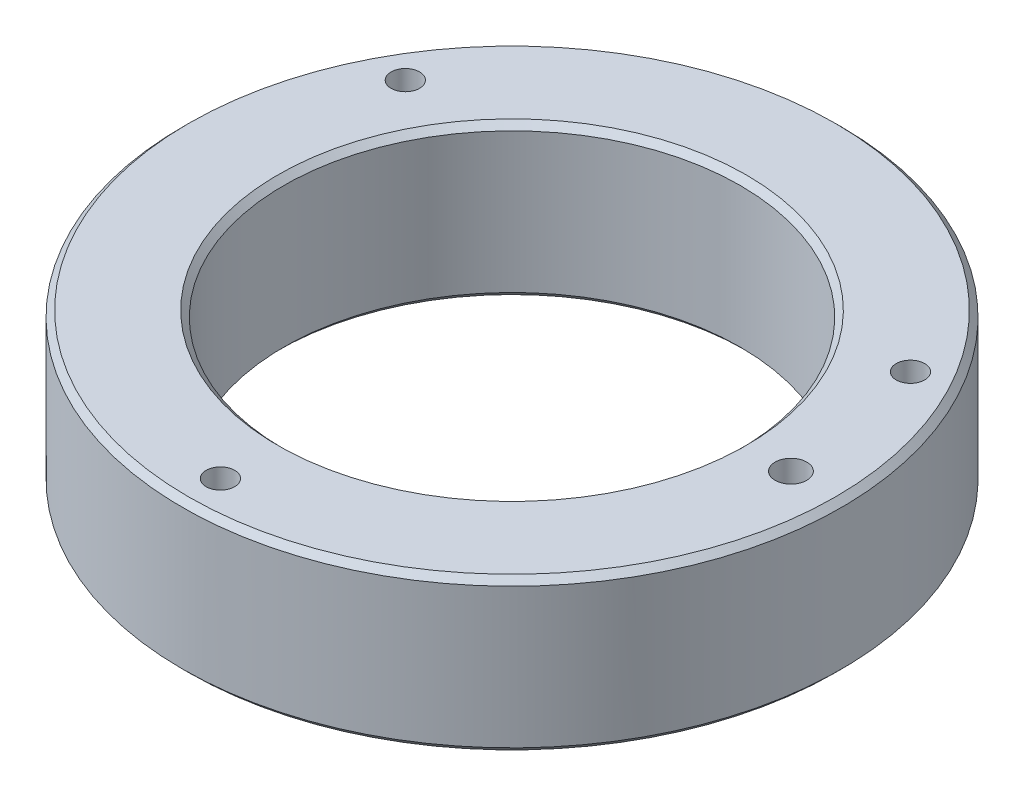
ISO-10303-21;
HEADER;
FILE_DESCRIPTION(('STEP AP214'),'2;1');
FILE_NAME('part.step','',(''),(''),'','','');
FILE_SCHEMA(('AUTOMOTIVE_DESIGN { 1 0 10303 214 1 1 1 1 }'));
ENDSEC;
DATA;
#1=APPLICATION_CONTEXT('core data for automotive mechanical design processes');
#2=APPLICATION_PROTOCOL_DEFINITION('international standard','automotive_design',2000,#1);
#3=PRODUCT_CONTEXT('',#1,'mechanical');
#4=PRODUCT('Part','Part','',(#3));
#5=PRODUCT_RELATED_PRODUCT_CATEGORY('part','',(#4));
#6=PRODUCT_DEFINITION_FORMATION('','',#4);
#7=PRODUCT_DEFINITION_CONTEXT('part definition',#1,'design');
#8=PRODUCT_DEFINITION('design','',#6,#7);
#9=PRODUCT_DEFINITION_SHAPE('','',#8);
#10=(LENGTH_UNIT() NAMED_UNIT(*) SI_UNIT(.MILLI.,.METRE.));
#11=(NAMED_UNIT(*) PLANE_ANGLE_UNIT() SI_UNIT($,.RADIAN.));
#12=(NAMED_UNIT(*) SI_UNIT($,.STERADIAN.) SOLID_ANGLE_UNIT());
#13=UNCERTAINTY_MEASURE_WITH_UNIT(LENGTH_MEASURE(1.E-05),#10,'distance_accuracy_value','');
#14=(GEOMETRIC_REPRESENTATION_CONTEXT(3) GLOBAL_UNCERTAINTY_ASSIGNED_CONTEXT((#13)) GLOBAL_UNIT_ASSIGNED_CONTEXT((#10,
#11,#12)) REPRESENTATION_CONTEXT('',''));
#15=CARTESIAN_POINT('',(0.,0.,0.));
#16=DIRECTION('',(0.,0.,1.));
#17=DIRECTION('',(1.,0.,0.));
#18=AXIS2_PLACEMENT_3D('',#15,#16,#17);
#19=CARTESIAN_POINT('',(-57.15,-19.05,0.));
#20=DIRECTION('',(0.,1.,0.));
#21=DIRECTION('',(0.,0.,1.));
#22=AXIS2_PLACEMENT_3D('',#19,#20,#21);
#23=PLANE('',#22);
#24=CARTESIAN_POINT('',(69.85,-19.05,0.));
#25=DIRECTION('',(0.,-1.,0.));
#26=DIRECTION('',(0.,0.,-1.));
#27=AXIS2_PLACEMENT_3D('',#24,#25,#26);
#28=CIRCLE('',#27,3.96874999999999);
#29=CARTESIAN_POINT('',(69.85,-19.05,-3.96874999999999));
#30=VERTEX_POINT('',#29);
#31=EDGE_CURVE('E117',#30,#30,#28,.T.);
#32=ORIENTED_EDGE('',*,*,#31,.F.);
#33=EDGE_LOOP('',(#32));
#34=FACE_BOUND('',#33,.T.);
#35=CARTESIAN_POINT('',(0.,-19.05,73.025));
#36=DIRECTION('',(0.,-1.,0.));
#37=DIRECTION('',(0.,0.,-1.));
#38=AXIS2_PLACEMENT_3D('',#35,#36,#37);
#39=CIRCLE('',#38,5.56259999999999);
#40=CARTESIAN_POINT('',(0.,-19.05,67.4624));
#41=VERTEX_POINT('',#40);
#42=EDGE_CURVE('E111',#41,#41,#39,.T.);
#43=ORIENTED_EDGE('',*,*,#42,.F.);
#44=EDGE_LOOP('',(#43));
#45=FACE_BOUND('',#44,.T.);
#46=CARTESIAN_POINT('',(63.246,-19.05,-36.5252));
#47=DIRECTION('',(0.,-1.,0.));
#48=DIRECTION('',(0.,0.,-1.));
#49=AXIS2_PLACEMENT_3D('',#46,#47,#48);
#50=CIRCLE('',#49,5.5626);
#51=CARTESIAN_POINT('',(63.246,-19.05,-42.0878));
#52=VERTEX_POINT('',#51);
#53=EDGE_CURVE('E99',#52,#52,#50,.T.);
#54=ORIENTED_EDGE('',*,*,#53,.F.);
#55=EDGE_LOOP('',(#54));
#56=FACE_BOUND('',#55,.T.);
#57=CARTESIAN_POINT('',(-63.246,-19.05,-36.5252));
#58=DIRECTION('',(0.,-1.,0.));
#59=DIRECTION('',(0.,0.,-1.));
#60=AXIS2_PLACEMENT_3D('',#57,#58,#59);
#61=CIRCLE('',#60,5.56259999999999);
#62=CARTESIAN_POINT('',(-63.246,-19.05,-42.0878));
#63=VERTEX_POINT('',#62);
#64=EDGE_CURVE('E87',#63,#63,#61,.T.);
#65=ORIENTED_EDGE('',*,*,#64,.F.);
#66=EDGE_LOOP('',(#65));
#67=FACE_BOUND('',#66,.T.);
#68=CARTESIAN_POINT('',(0.,-19.05,0.));
#69=DIRECTION('',(0.,1.,0.));
#70=DIRECTION('',(0.,0.,1.));
#71=AXIS2_PLACEMENT_3D('',#68,#69,#70);
#72=CIRCLE('',#71,58.674);
#73=CARTESIAN_POINT('',(0.,-19.05,-58.674));
#74=VERTEX_POINT('',#73);
#75=EDGE_CURVE('E57',#74,#74,#72,.T.);
#76=ORIENTED_EDGE('',*,*,#75,.T.);
#77=EDGE_LOOP('',(#76));
#78=FACE_BOUND('',#77,.T.);
#79=CARTESIAN_POINT('',(0.,-19.05,0.));
#80=DIRECTION('',(0.,1.,0.));
#81=DIRECTION('',(0.,0.,1.));
#82=AXIS2_PLACEMENT_3D('',#79,#80,#81);
#83=CIRCLE('',#82,81.0006);
#84=CARTESIAN_POINT('',(0.,-19.05,81.0006));
#85=VERTEX_POINT('',#84);
#86=EDGE_CURVE('E61',#85,#85,#83,.F.);
#87=ORIENTED_EDGE('',*,*,#86,.T.);
#88=EDGE_LOOP('',(#87));
#89=FACE_BOUND('',#88,.T.);
#90=ADVANCED_FACE('F45',(#34,#45,#56,#67,#78,#89),#23,.F.);
#91=CARTESIAN_POINT('',(0.,-44.45,0.));
#92=DIRECTION('',(0.,-1.,0.));
#93=DIRECTION('',(0.,0.,-1.));
#94=AXIS2_PLACEMENT_3D('',#91,#92,#93);
#95=CYLINDRICAL_SURFACE('',#94,82.5246);
#96=CARTESIAN_POINT('',(0.,17.526,0.));
#97=DIRECTION('',(0.,-1.,0.));
#98=DIRECTION('',(0.,0.,-1.));
#99=AXIS2_PLACEMENT_3D('',#96,#97,#98);
#100=CIRCLE('',#99,82.5246);
#101=CARTESIAN_POINT('',(0.,17.526,-82.5246));
#102=VERTEX_POINT('',#101);
#103=EDGE_CURVE('E10',#102,#102,#100,.T.);
#104=ORIENTED_EDGE('',*,*,#103,.T.);
#105=EDGE_LOOP('',(#104));
#106=FACE_BOUND('',#105,.T.);
#107=CARTESIAN_POINT('',(0.,-17.526,0.));
#108=DIRECTION('',(0.,1.,0.));
#109=DIRECTION('',(0.,0.,1.));
#110=AXIS2_PLACEMENT_3D('',#107,#108,#109);
#111=CIRCLE('',#110,82.5246);
#112=CARTESIAN_POINT('',(0.,-17.526,82.5246));
#113=VERTEX_POINT('',#112);
#114=EDGE_CURVE('E53',#113,#113,#111,.T.);
#115=ORIENTED_EDGE('',*,*,#114,.T.);
#116=EDGE_LOOP('',(#115));
#117=FACE_BOUND('',#116,.T.);
#118=ADVANCED_FACE('F125',(#106,#117),#95,.T.);
#119=CARTESIAN_POINT('',(-82.5246,19.05,0.));
#120=DIRECTION('',(0.,-1.,0.));
#121=DIRECTION('',(0.,0.,-1.));
#122=AXIS2_PLACEMENT_3D('',#119,#120,#121);
#123=PLANE('',#122);
#124=CARTESIAN_POINT('',(69.85,19.05,0.));
#125=DIRECTION('',(0.,-1.,0.));
#126=DIRECTION('',(0.,0.,-1.));
#127=AXIS2_PLACEMENT_3D('',#124,#125,#126);
#128=CIRCLE('',#127,3.96874999999998);
#129=CARTESIAN_POINT('',(69.85,19.05,-3.96874999999998));
#130=VERTEX_POINT('',#129);
#131=EDGE_CURVE('E114',#130,#130,#128,.T.);
#132=ORIENTED_EDGE('',*,*,#131,.T.);
#133=EDGE_LOOP('',(#132));
#134=FACE_BOUND('',#133,.T.);
#135=CARTESIAN_POINT('',(0.,19.05,73.025));
#136=DIRECTION('',(0.,-1.,0.));
#137=DIRECTION('',(0.,0.,-1.));
#138=AXIS2_PLACEMENT_3D('',#135,#136,#137);
#139=CIRCLE('',#138,3.56869999999999);
#140=CARTESIAN_POINT('',(0.,19.05,69.4563));
#141=VERTEX_POINT('',#140);
#142=EDGE_CURVE('E102',#141,#141,#139,.T.);
#143=ORIENTED_EDGE('',*,*,#142,.T.);
#144=EDGE_LOOP('',(#143));
#145=FACE_BOUND('',#144,.T.);
#146=CARTESIAN_POINT('',(63.246,19.05,-36.5252));
#147=DIRECTION('',(0.,-1.,0.));
#148=DIRECTION('',(0.,0.,-1.));
#149=AXIS2_PLACEMENT_3D('',#146,#147,#148);
#150=CIRCLE('',#149,3.56869999999999);
#151=CARTESIAN_POINT('',(63.246,19.05,-40.0939));
#152=VERTEX_POINT('',#151);
#153=EDGE_CURVE('E90',#152,#152,#150,.T.);
#154=ORIENTED_EDGE('',*,*,#153,.T.);
#155=EDGE_LOOP('',(#154));
#156=FACE_BOUND('',#155,.T.);
#157=CARTESIAN_POINT('',(-63.246,19.05,-36.5252));
#158=DIRECTION('',(0.,-1.,0.));
#159=DIRECTION('',(0.,0.,-1.));
#160=AXIS2_PLACEMENT_3D('',#157,#158,#159);
#161=CIRCLE('',#160,3.56869999999999);
#162=CARTESIAN_POINT('',(-63.246,19.05,-40.0939));
#163=VERTEX_POINT('',#162);
#164=EDGE_CURVE('E78',#163,#163,#161,.T.);
#165=ORIENTED_EDGE('',*,*,#164,.T.);
#166=EDGE_LOOP('',(#165));
#167=FACE_BOUND('',#166,.T.);
#168=CARTESIAN_POINT('',(0.,19.05,0.));
#169=DIRECTION('',(0.,-1.,0.));
#170=DIRECTION('',(0.,0.,-1.));
#171=AXIS2_PLACEMENT_3D('',#168,#169,#170);
#172=CIRCLE('',#171,58.674);
#173=CARTESIAN_POINT('',(0.,19.05,-58.674));
#174=VERTEX_POINT('',#173);
#175=EDGE_CURVE('E72',#174,#174,#172,.T.);
#176=ORIENTED_EDGE('',*,*,#175,.T.);
#177=EDGE_LOOP('',(#176));
#178=FACE_BOUND('',#177,.T.);
#179=CARTESIAN_POINT('',(0.,19.05,0.));
#180=DIRECTION('',(0.,-1.,0.));
#181=DIRECTION('',(0.,0.,-1.));
#182=AXIS2_PLACEMENT_3D('',#179,#180,#181);
#183=CIRCLE('',#182,81.0006);
#184=CARTESIAN_POINT('',(0.,19.05,-81.0006));
#185=VERTEX_POINT('',#184);
#186=EDGE_CURVE('E75',#185,#185,#183,.F.);
#187=ORIENTED_EDGE('',*,*,#186,.T.);
#188=EDGE_LOOP('',(#187));
#189=FACE_BOUND('',#188,.T.);
#190=ADVANCED_FACE('F174',(#134,#145,#156,#167,#178,#189),#123,.F.);
#191=CARTESIAN_POINT('',(0.,-44.45,0.));
#192=DIRECTION('',(0.,-1.,0.));
#193=DIRECTION('',(0.,0.,-1.));
#194=AXIS2_PLACEMENT_3D('',#191,#192,#193);
#195=CYLINDRICAL_SURFACE('',#194,57.15);
#196=CARTESIAN_POINT('',(0.,17.526,0.));
#197=DIRECTION('',(0.,-1.,0.));
#198=DIRECTION('',(0.,0.,-1.));
#199=AXIS2_PLACEMENT_3D('',#196,#197,#198);
#200=CIRCLE('',#199,57.15);
#201=CARTESIAN_POINT('',(0.,17.526,-57.15));
#202=VERTEX_POINT('',#201);
#203=EDGE_CURVE('E66',#202,#202,#200,.F.);
#204=CARTESIAN_POINT('',(0.,-17.526,0.));
#205=DIRECTION('',(0.,1.,0.));
#206=DIRECTION('',(0.,0.,1.));
#207=AXIS2_PLACEMENT_3D('',#204,#205,#206);
#208=CIRCLE('',#207,57.15);
#209=CARTESIAN_POINT('',(0.,-17.526,-57.15));
#210=VERTEX_POINT('',#209);
#211=EDGE_CURVE('E69',#210,#210,#208,.F.);
#212=CARTESIAN_POINT('',(0.,17.526,-57.15));
#213=CARTESIAN_POINT('',(0.,17.160875,-57.15));
#214=CARTESIAN_POINT('',(0.,16.79575,-57.15));
#215=CARTESIAN_POINT('',(0.,16.0655,-57.15));
#216=CARTESIAN_POINT('',(0.,15.700375,-57.15));
#217=CARTESIAN_POINT('',(0.,14.970125,-57.15));
#218=CARTESIAN_POINT('',(0.,14.605,-57.15));
#219=CARTESIAN_POINT('',(0.,13.87475,-57.15));
#220=CARTESIAN_POINT('',(0.,13.509625,-57.15));
#221=CARTESIAN_POINT('',(0.,12.779375,-57.15));
#222=CARTESIAN_POINT('',(0.,12.41425,-57.15));
#223=CARTESIAN_POINT('',(0.,11.684,-57.15));
#224=CARTESIAN_POINT('',(0.,11.318875,-57.15));
#225=CARTESIAN_POINT('',(0.,10.588625,-57.15));
#226=CARTESIAN_POINT('',(0.,10.2235,-57.15));
#227=CARTESIAN_POINT('',(0.,9.49324999999998,-57.15));
#228=CARTESIAN_POINT('',(0.,9.12812499999998,-57.15));
#229=CARTESIAN_POINT('',(0.,8.39787499999998,-57.15));
#230=CARTESIAN_POINT('',(0.,8.03274999999998,-57.15));
#231=CARTESIAN_POINT('',(0.,7.30249999999998,-57.15));
#232=CARTESIAN_POINT('',(0.,6.93737499999998,-57.15));
#233=CARTESIAN_POINT('',(0.,6.20712499999998,-57.15));
#234=CARTESIAN_POINT('',(0.,5.84199999999998,-57.15));
#235=CARTESIAN_POINT('',(0.,5.11174999999998,-57.15));
#236=CARTESIAN_POINT('',(0.,4.74662499999998,-57.15));
#237=CARTESIAN_POINT('',(0.,4.01637499999998,-57.15));
#238=CARTESIAN_POINT('',(0.,3.65124999999998,-57.15));
#239=CARTESIAN_POINT('',(0.,2.92099999999998,-57.15));
#240=CARTESIAN_POINT('',(0.,2.55587499999998,-57.15));
#241=CARTESIAN_POINT('',(0.,1.82562499999998,-57.15));
#242=CARTESIAN_POINT('',(0.,1.46049999999998,-57.15));
#243=CARTESIAN_POINT('',(0.,0.730249999999976,-57.15));
#244=CARTESIAN_POINT('',(0.,0.365124999999978,-57.15));
#245=CARTESIAN_POINT('',(0.,-0.365125000000019,-57.15));
#246=CARTESIAN_POINT('',(0.,-0.730250000000018,-57.15));
#247=CARTESIAN_POINT('',(0.,-1.46050000000002,-57.15));
#248=CARTESIAN_POINT('',(0.,-1.82562500000002,-57.15));
#249=CARTESIAN_POINT('',(0.,-2.55587500000002,-57.15));
#250=CARTESIAN_POINT('',(0.,-2.92100000000002,-57.15));
#251=CARTESIAN_POINT('',(0.,-3.65125000000002,-57.15));
#252=CARTESIAN_POINT('',(0.,-4.01637500000002,-57.15));
#253=CARTESIAN_POINT('',(0.,-4.74662500000002,-57.15));
#254=CARTESIAN_POINT('',(0.,-5.11175000000002,-57.15));
#255=CARTESIAN_POINT('',(0.,-5.84200000000002,-57.15));
#256=CARTESIAN_POINT('',(0.,-6.20712500000002,-57.15));
#257=CARTESIAN_POINT('',(0.,-6.93737500000002,-57.15));
#258=CARTESIAN_POINT('',(0.,-7.30250000000002,-57.15));
#259=CARTESIAN_POINT('',(0.,-8.03275000000002,-57.15));
#260=CARTESIAN_POINT('',(0.,-8.39787500000002,-57.15));
#261=CARTESIAN_POINT('',(0.,-9.12812500000002,-57.15));
#262=CARTESIAN_POINT('',(0.,-9.49325000000002,-57.15));
#263=CARTESIAN_POINT('',(0.,-10.2235,-57.15));
#264=CARTESIAN_POINT('',(0.,-10.588625,-57.15));
#265=CARTESIAN_POINT('',(0.,-11.318875,-57.15));
#266=CARTESIAN_POINT('',(0.,-11.684,-57.15));
#267=CARTESIAN_POINT('',(0.,-12.41425,-57.15));
#268=CARTESIAN_POINT('',(0.,-12.779375,-57.15));
#269=CARTESIAN_POINT('',(0.,-13.509625,-57.15));
#270=CARTESIAN_POINT('',(0.,-13.87475,-57.15));
#271=CARTESIAN_POINT('',(0.,-14.605,-57.15));
#272=CARTESIAN_POINT('',(0.,-14.970125,-57.15));
#273=CARTESIAN_POINT('',(0.,-15.700375,-57.15));
#274=CARTESIAN_POINT('',(0.,-16.0655,-57.15));
#275=CARTESIAN_POINT('',(0.,-16.79575,-57.15));
#276=CARTESIAN_POINT('',(0.,-17.160875,-57.15));
#277=CARTESIAN_POINT('',(0.,-17.526,-57.15));
#278=B_SPLINE_CURVE_WITH_KNOTS('',3,(#212,#213,#214,#215,#216,#217,#218,#219,#220,#221,#222,
#223,#224,#225,#226,#227,#228,#229,#230,#231,#232,#233,#234,#235,#236,#237,#238,#239,#240,#241,
#242,#243,#244,#245,#246,#247,#248,#249,#250,#251,#252,#253,#254,#255,#256,#257,#258,#259,#260,
#261,#262,#263,#264,#265,#266,#267,#268,#269,#270,#271,#272,#273,#274,#275,#276,#277),
.UNSPECIFIED.,.F.,.F.,(4,2,2,2,2,2,2,2,2,2,2,2,2,2,2,2,2,2,2,2,2,2,2,2,2,2,2,2,2,2,2,2,4),(0.,
1.095375,2.19075,3.286125,4.3815,5.476875,6.57225,7.667625,8.763,9.858375,10.95375,12.049125,
13.1445,14.239875,15.33525,16.430625,17.526,18.621375,19.71675,20.812125,21.9075,23.002875,
24.09825,25.193625,26.289,27.384375,28.47975,29.575125,30.6705,31.765875,32.86125,33.956625,
35.052),.UNSPECIFIED.);
#279=EDGE_CURVE('BSEAM169',#202,#210,#278,.T.);
#280=ORIENTED_EDGE('',*,*,#203,.T.);
#281=ORIENTED_EDGE('',*,*,#211,.T.);
#282=ORIENTED_EDGE('',*,*,#279,.T.);
#283=ORIENTED_EDGE('',*,*,#279,.F.);
#284=EDGE_LOOP('',(#280,#282,#281,#283));
#285=FACE_BOUND('',#284,.T.);
#286=ADVANCED_FACE('F169',(#285),#195,.F.);
#287=CARTESIAN_POINT('',(0.,19.05,0.));
#288=DIRECTION('',(0.,1.,0.));
#289=DIRECTION('',(0.,0.,1.));
#290=AXIS2_PLACEMENT_3D('',#287,#288,#289);
#291=CONICAL_SURFACE('',#290,58.674,0.785398163397435);
#292=ORIENTED_EDGE('',*,*,#203,.F.);
#293=EDGE_LOOP('',(#292));
#294=FACE_BOUND('',#293,.T.);
#295=ORIENTED_EDGE('',*,*,#175,.F.);
#296=EDGE_LOOP('',(#295));
#297=FACE_BOUND('',#296,.T.);
#298=ADVANCED_FACE('F153',(#294,#297),#291,.F.);
#299=CARTESIAN_POINT('',(0.,-17.526,0.));
#300=DIRECTION('',(0.,-1.,0.));
#301=DIRECTION('',(0.,0.,-1.));
#302=AXIS2_PLACEMENT_3D('',#299,#300,#301);
#303=CONICAL_SURFACE('',#302,57.15,0.785398163397451);
#304=CARTESIAN_POINT('',(0.,-19.05,-58.674));
#305=CARTESIAN_POINT('',(0.,-19.034125,-58.658125));
#306=CARTESIAN_POINT('',(0.,-19.01825,-58.64225));
#307=CARTESIAN_POINT('',(0.,-18.9865,-58.6105));
#308=CARTESIAN_POINT('',(0.,-18.970625,-58.594625));
#309=CARTESIAN_POINT('',(0.,-18.938875,-58.562875));
#310=CARTESIAN_POINT('',(0.,-18.923,-58.547));
#311=CARTESIAN_POINT('',(0.,-18.89125,-58.51525));
#312=CARTESIAN_POINT('',(0.,-18.875375,-58.499375));
#313=CARTESIAN_POINT('',(0.,-18.843625,-58.467625));
#314=CARTESIAN_POINT('',(0.,-18.82775,-58.45175));
#315=CARTESIAN_POINT('',(0.,-18.796,-58.42));
#316=CARTESIAN_POINT('',(0.,-18.780125,-58.404125));
#317=CARTESIAN_POINT('',(0.,-18.748375,-58.372375));
#318=CARTESIAN_POINT('',(0.,-18.7325,-58.3565));
#319=CARTESIAN_POINT('',(0.,-18.70075,-58.32475));
#320=CARTESIAN_POINT('',(0.,-18.684875,-58.308875));
#321=CARTESIAN_POINT('',(0.,-18.653125,-58.277125));
#322=CARTESIAN_POINT('',(0.,-18.63725,-58.26125));
#323=CARTESIAN_POINT('',(0.,-18.6055,-58.2295));
#324=CARTESIAN_POINT('',(0.,-18.589625,-58.213625));
#325=CARTESIAN_POINT('',(0.,-18.557875,-58.181875));
#326=CARTESIAN_POINT('',(0.,-18.542,-58.166));
#327=CARTESIAN_POINT('',(0.,-18.51025,-58.13425));
#328=CARTESIAN_POINT('',(0.,-18.494375,-58.118375));
#329=CARTESIAN_POINT('',(0.,-18.462625,-58.086625));
#330=CARTESIAN_POINT('',(0.,-18.44675,-58.07075));
#331=CARTESIAN_POINT('',(0.,-18.415,-58.039));
#332=CARTESIAN_POINT('',(0.,-18.399125,-58.023125));
#333=CARTESIAN_POINT('',(0.,-18.367375,-57.991375));
#334=CARTESIAN_POINT('',(0.,-18.3515,-57.9755));
#335=CARTESIAN_POINT('',(0.,-18.31975,-57.94375));
#336=CARTESIAN_POINT('',(0.,-18.303875,-57.927875));
#337=CARTESIAN_POINT('',(0.,-18.272125,-57.896125));
#338=CARTESIAN_POINT('',(0.,-18.25625,-57.88025));
#339=CARTESIAN_POINT('',(0.,-18.2245,-57.8485));
#340=CARTESIAN_POINT('',(0.,-18.208625,-57.832625));
#341=CARTESIAN_POINT('',(0.,-18.176875,-57.800875));
#342=CARTESIAN_POINT('',(0.,-18.161,-57.785));
#343=CARTESIAN_POINT('',(0.,-18.12925,-57.75325));
#344=CARTESIAN_POINT('',(0.,-18.113375,-57.737375));
#345=CARTESIAN_POINT('',(0.,-18.081625,-57.705625));
#346=CARTESIAN_POINT('',(0.,-18.06575,-57.68975));
#347=CARTESIAN_POINT('',(0.,-18.034,-57.658));
#348=CARTESIAN_POINT('',(0.,-18.018125,-57.642125));
#349=CARTESIAN_POINT('',(0.,-17.986375,-57.610375));
#350=CARTESIAN_POINT('',(0.,-17.9705,-57.5945));
#351=CARTESIAN_POINT('',(0.,-17.93875,-57.56275));
#352=CARTESIAN_POINT('',(0.,-17.922875,-57.546875));
#353=CARTESIAN_POINT('',(0.,-17.891125,-57.515125));
#354=CARTESIAN_POINT('',(0.,-17.87525,-57.49925));
#355=CARTESIAN_POINT('',(0.,-17.8435,-57.4675));
#356=CARTESIAN_POINT('',(0.,-17.827625,-57.451625));
#357=CARTESIAN_POINT('',(0.,-17.795875,-57.419875));
#358=CARTESIAN_POINT('',(0.,-17.78,-57.404));
#359=CARTESIAN_POINT('',(0.,-17.74825,-57.37225));
#360=CARTESIAN_POINT('',(0.,-17.732375,-57.356375));
#361=CARTESIAN_POINT('',(0.,-17.700625,-57.324625));
#362=CARTESIAN_POINT('',(0.,-17.68475,-57.30875));
#363=CARTESIAN_POINT('',(0.,-17.653,-57.277));
#364=CARTESIAN_POINT('',(0.,-17.637125,-57.261125));
#365=CARTESIAN_POINT('',(0.,-17.605375,-57.229375));
#366=CARTESIAN_POINT('',(0.,-17.5895,-57.2135));
#367=CARTESIAN_POINT('',(0.,-17.55775,-57.18175));
#368=CARTESIAN_POINT('',(0.,-17.541875,-57.165875));
#369=CARTESIAN_POINT('',(0.,-17.526,-57.15));
#370=B_SPLINE_CURVE_WITH_KNOTS('',3,(#304,#305,#306,#307,#308,#309,#310,#311,#312,#313,#314,
#315,#316,#317,#318,#319,#320,#321,#322,#323,#324,#325,#326,#327,#328,#329,#330,#331,#332,#333,
#334,#335,#336,#337,#338,#339,#340,#341,#342,#343,#344,#345,#346,#347,#348,#349,#350,#351,#352,
#353,#354,#355,#356,#357,#358,#359,#360,#361,#362,#363,#364,#365,#366,#367,#368,#369),
.UNSPECIFIED.,.F.,.F.,(4,2,2,2,2,2,2,2,2,2,2,2,2,2,2,2,2,2,2,2,2,2,2,2,2,2,2,2,2,2,2,2,4),(0.,
0.0673519209080149,0.134703841816037,0.202055762724052,0.269407683632072,0.336759604540087,
0.404111525448106,0.471463446356126,0.538815367264141,0.606167288172161,0.673519209080176,
0.740871129988195,0.80822305089621,0.87557497180423,0.94292689271225,1.01027881362026,
1.07763073452828,1.1449826554363,1.21233457634432,1.27968649725234,1.34703841816036,
1.41439033906838,1.48174225997639,1.54909418088441,1.61644610179242,1.68379802270044,
1.75114994360846,1.81850186451648,1.88585378542449,1.95320570633251,2.02055762724053,
2.08790954814855,2.15526146905657),.UNSPECIFIED.);
#371=EDGE_CURVE('BSEAM148',#74,#210,#370,.T.);
#372=ORIENTED_EDGE('',*,*,#75,.F.);
#373=ORIENTED_EDGE('',*,*,#211,.F.);
#374=ORIENTED_EDGE('',*,*,#371,.T.);
#375=ORIENTED_EDGE('',*,*,#371,.F.);
#376=EDGE_LOOP('',(#372,#374,#373,#375));
#377=FACE_BOUND('',#376,.T.);
#378=ADVANCED_FACE('F148',(#377),#303,.F.);
#379=CARTESIAN_POINT('',(0.,17.526,0.));
#380=DIRECTION('',(0.,-1.,0.));
#381=DIRECTION('',(0.,0.,-1.));
#382=AXIS2_PLACEMENT_3D('',#379,#380,#381);
#383=CONICAL_SURFACE('',#382,82.5246,0.785398163397451);
#384=ORIENTED_EDGE('',*,*,#186,.F.);
#385=EDGE_LOOP('',(#384));
#386=FACE_BOUND('',#385,.T.);
#387=ORIENTED_EDGE('',*,*,#103,.F.);
#388=EDGE_LOOP('',(#387));
#389=FACE_BOUND('',#388,.T.);
#390=ADVANCED_FACE('F139',(#386,#389),#383,.T.);
#391=CARTESIAN_POINT('',(0.,-19.05,0.));
#392=DIRECTION('',(0.,1.,0.));
#393=DIRECTION('',(0.,0.,1.));
#394=AXIS2_PLACEMENT_3D('',#391,#392,#393);
#395=CONICAL_SURFACE('',#394,81.0006,0.785398163397448);
#396=ORIENTED_EDGE('',*,*,#114,.F.);
#397=EDGE_LOOP('',(#396));
#398=FACE_BOUND('',#397,.T.);
#399=ORIENTED_EDGE('',*,*,#86,.F.);
#400=EDGE_LOOP('',(#399));
#401=FACE_BOUND('',#400,.T.);
#402=ADVANCED_FACE('F48',(#398,#401),#395,.T.);
#403=CARTESIAN_POINT('',(-63.246,-19.05,-36.5252));
#404=DIRECTION('',(0.,-1.,0.));
#405=DIRECTION('',(0.,0.,-1.));
#406=AXIS2_PLACEMENT_3D('',#403,#404,#405);
#407=CYLINDRICAL_SURFACE('',#406,3.56869999999999);
#408=ORIENTED_EDGE('',*,*,#164,.F.);
#409=EDGE_LOOP('',(#408));
#410=FACE_BOUND('',#409,.T.);
#411=CARTESIAN_POINT('',(-63.246,-9.39800000000001,-36.5252));
#412=DIRECTION('',(0.,-1.,0.));
#413=DIRECTION('',(0.,0.,-1.));
#414=AXIS2_PLACEMENT_3D('',#411,#412,#413);
#415=CIRCLE('',#414,3.56869999999999);
#416=CARTESIAN_POINT('',(-63.246,-9.39800000000001,-40.0939));
#417=VERTEX_POINT('',#416);
#418=EDGE_CURVE('E81',#417,#417,#415,.T.);
#419=ORIENTED_EDGE('',*,*,#418,.T.);
#420=EDGE_LOOP('',(#419));
#421=FACE_BOUND('',#420,.T.);
#422=ADVANCED_FACE('F138',(#410,#421),#407,.F.);
#423=CARTESIAN_POINT('',(-59.6773,-9.398,-36.5252));
#424=DIRECTION('',(0.,1.,0.));
#425=DIRECTION('',(0.,0.,1.));
#426=AXIS2_PLACEMENT_3D('',#423,#424,#425);
#427=PLANE('',#426);
#428=ORIENTED_EDGE('',*,*,#418,.F.);
#429=EDGE_LOOP('',(#428));
#430=FACE_BOUND('',#429,.T.);
#431=CARTESIAN_POINT('',(-63.246,-9.398,-36.5252));
#432=DIRECTION('',(0.,-1.,0.));
#433=DIRECTION('',(0.,0.,-1.));
#434=AXIS2_PLACEMENT_3D('',#431,#432,#433);
#435=CIRCLE('',#434,5.56259999999999);
#436=CARTESIAN_POINT('',(-63.246,-9.398,-42.0878));
#437=VERTEX_POINT('',#436);
#438=EDGE_CURVE('E84',#437,#437,#435,.T.);
#439=ORIENTED_EDGE('',*,*,#438,.T.);
#440=EDGE_LOOP('',(#439));
#441=FACE_BOUND('',#440,.T.);
#442=ADVANCED_FACE('F145',(#430,#441),#427,.F.);
#443=CARTESIAN_POINT('',(-63.246,-19.05,-36.5252));
#444=DIRECTION('',(0.,-1.,0.));
#445=DIRECTION('',(0.,0.,-1.));
#446=AXIS2_PLACEMENT_3D('',#443,#444,#445);
#447=CYLINDRICAL_SURFACE('',#446,5.56259999999999);
#448=ORIENTED_EDGE('',*,*,#438,.F.);
#449=EDGE_LOOP('',(#448));
#450=FACE_BOUND('',#449,.T.);
#451=ORIENTED_EDGE('',*,*,#64,.T.);
#452=EDGE_LOOP('',(#451));
#453=FACE_BOUND('',#452,.T.);
#454=ADVANCED_FACE('F183',(#450,#453),#447,.F.);
#455=CARTESIAN_POINT('',(63.246,-19.05,-36.5252));
#456=DIRECTION('',(0.,-1.,0.));
#457=DIRECTION('',(0.,0.,-1.));
#458=AXIS2_PLACEMENT_3D('',#455,#456,#457);
#459=CYLINDRICAL_SURFACE('',#458,3.56869999999999);
#460=ORIENTED_EDGE('',*,*,#153,.F.);
#461=EDGE_LOOP('',(#460));
#462=FACE_BOUND('',#461,.T.);
#463=CARTESIAN_POINT('',(63.246,-9.39800000000001,-36.5252));
#464=DIRECTION('',(0.,-1.,0.));
#465=DIRECTION('',(0.,0.,-1.));
#466=AXIS2_PLACEMENT_3D('',#463,#464,#465);
#467=CIRCLE('',#466,3.56869999999998);
#468=CARTESIAN_POINT('',(63.246,-9.39800000000001,-40.0939));
#469=VERTEX_POINT('',#468);
#470=EDGE_CURVE('E93',#469,#469,#467,.T.);
#471=ORIENTED_EDGE('',*,*,#470,.T.);
#472=EDGE_LOOP('',(#471));
#473=FACE_BOUND('',#472,.T.);
#474=ADVANCED_FACE('F187',(#462,#473),#459,.F.);
#475=CARTESIAN_POINT('',(66.8147,-9.398,-36.5252));
#476=DIRECTION('',(0.,1.,0.));
#477=DIRECTION('',(0.,0.,1.));
#478=AXIS2_PLACEMENT_3D('',#475,#476,#477);
#479=PLANE('',#478);
#480=ORIENTED_EDGE('',*,*,#470,.F.);
#481=EDGE_LOOP('',(#480));
#482=FACE_BOUND('',#481,.T.);
#483=CARTESIAN_POINT('',(63.246,-9.398,-36.5252));
#484=DIRECTION('',(0.,-1.,0.));
#485=DIRECTION('',(0.,0.,-1.));
#486=AXIS2_PLACEMENT_3D('',#483,#484,#485);
#487=CIRCLE('',#486,5.5626);
#488=CARTESIAN_POINT('',(63.246,-9.398,-42.0878));
#489=VERTEX_POINT('',#488);
#490=EDGE_CURVE('E96',#489,#489,#487,.T.);
#491=ORIENTED_EDGE('',*,*,#490,.T.);
#492=EDGE_LOOP('',(#491));
#493=FACE_BOUND('',#492,.T.);
#494=ADVANCED_FACE('F191',(#482,#493),#479,.F.);
#495=CARTESIAN_POINT('',(63.246,-19.05,-36.5252));
#496=DIRECTION('',(0.,-1.,0.));
#497=DIRECTION('',(0.,0.,-1.));
#498=AXIS2_PLACEMENT_3D('',#495,#496,#497);
#499=CYLINDRICAL_SURFACE('',#498,5.5626);
#500=ORIENTED_EDGE('',*,*,#490,.F.);
#501=EDGE_LOOP('',(#500));
#502=FACE_BOUND('',#501,.T.);
#503=ORIENTED_EDGE('',*,*,#53,.T.);
#504=EDGE_LOOP('',(#503));
#505=FACE_BOUND('',#504,.T.);
#506=ADVANCED_FACE('F195',(#502,#505),#499,.F.);
#507=CARTESIAN_POINT('',(0.,-19.05,73.025));
#508=DIRECTION('',(0.,-1.,0.));
#509=DIRECTION('',(0.,0.,-1.));
#510=AXIS2_PLACEMENT_3D('',#507,#508,#509);
#511=CYLINDRICAL_SURFACE('',#510,3.56869999999999);
#512=ORIENTED_EDGE('',*,*,#142,.F.);
#513=EDGE_LOOP('',(#512));
#514=FACE_BOUND('',#513,.T.);
#515=CARTESIAN_POINT('',(0.,-9.39800000000001,73.025));
#516=DIRECTION('',(0.,-1.,0.));
#517=DIRECTION('',(0.,0.,-1.));
#518=AXIS2_PLACEMENT_3D('',#515,#516,#517);
#519=CIRCLE('',#518,3.56869999999999);
#520=CARTESIAN_POINT('',(0.,-9.39800000000001,69.4563));
#521=VERTEX_POINT('',#520);
#522=EDGE_CURVE('E105',#521,#521,#519,.T.);
#523=ORIENTED_EDGE('',*,*,#522,.T.);
#524=EDGE_LOOP('',(#523));
#525=FACE_BOUND('',#524,.T.);
#526=ADVANCED_FACE('F199',(#514,#525),#511,.F.);
#527=CARTESIAN_POINT('',(3.56869999999999,-9.398,73.025));
#528=DIRECTION('',(0.,1.,0.));
#529=DIRECTION('',(0.,0.,1.));
#530=AXIS2_PLACEMENT_3D('',#527,#528,#529);
#531=PLANE('',#530);
#532=ORIENTED_EDGE('',*,*,#522,.F.);
#533=EDGE_LOOP('',(#532));
#534=FACE_BOUND('',#533,.T.);
#535=CARTESIAN_POINT('',(0.,-9.398,73.025));
#536=DIRECTION('',(0.,-1.,0.));
#537=DIRECTION('',(0.,0.,-1.));
#538=AXIS2_PLACEMENT_3D('',#535,#536,#537);
#539=CIRCLE('',#538,5.56259999999999);
#540=CARTESIAN_POINT('',(0.,-9.398,67.4624));
#541=VERTEX_POINT('',#540);
#542=EDGE_CURVE('E108',#541,#541,#539,.T.);
#543=ORIENTED_EDGE('',*,*,#542,.T.);
#544=EDGE_LOOP('',(#543));
#545=FACE_BOUND('',#544,.T.);
#546=ADVANCED_FACE('F203',(#534,#545),#531,.F.);
#547=CARTESIAN_POINT('',(0.,-19.05,73.025));
#548=DIRECTION('',(0.,-1.,0.));
#549=DIRECTION('',(0.,0.,-1.));
#550=AXIS2_PLACEMENT_3D('',#547,#548,#549);
#551=CYLINDRICAL_SURFACE('',#550,5.56259999999999);
#552=ORIENTED_EDGE('',*,*,#542,.F.);
#553=EDGE_LOOP('',(#552));
#554=FACE_BOUND('',#553,.T.);
#555=ORIENTED_EDGE('',*,*,#42,.T.);
#556=EDGE_LOOP('',(#555));
#557=FACE_BOUND('',#556,.T.);
#558=ADVANCED_FACE('F207',(#554,#557),#551,.F.);
#559=CARTESIAN_POINT('',(69.85,-19.05,0.));
#560=DIRECTION('',(0.,-1.,0.));
#561=DIRECTION('',(0.,0.,-1.));
#562=AXIS2_PLACEMENT_3D('',#559,#560,#561);
#563=CYLINDRICAL_SURFACE('',#562,3.96874999999999);
#564=ORIENTED_EDGE('',*,*,#131,.F.);
#565=EDGE_LOOP('',(#564));
#566=FACE_BOUND('',#565,.T.);
#567=ORIENTED_EDGE('',*,*,#31,.T.);
#568=EDGE_LOOP('',(#567));
#569=FACE_BOUND('',#568,.T.);
#570=ADVANCED_FACE('F121',(#566,#569),#563,.F.);
#571=CLOSED_SHELL('',(#90,#118,#190,#286,#298,#378,#390,#402,#422,#442,#454,#474,#494,#506,#526,
#546,#558,#570));
#572=MANIFOLD_SOLID_BREP('B2',#571);
#573=ADVANCED_BREP_SHAPE_REPRESENTATION('',(#18,#572),#14);
#574=SHAPE_DEFINITION_REPRESENTATION(#9,#573);
ENDSEC;
END-ISO-10303-21;
